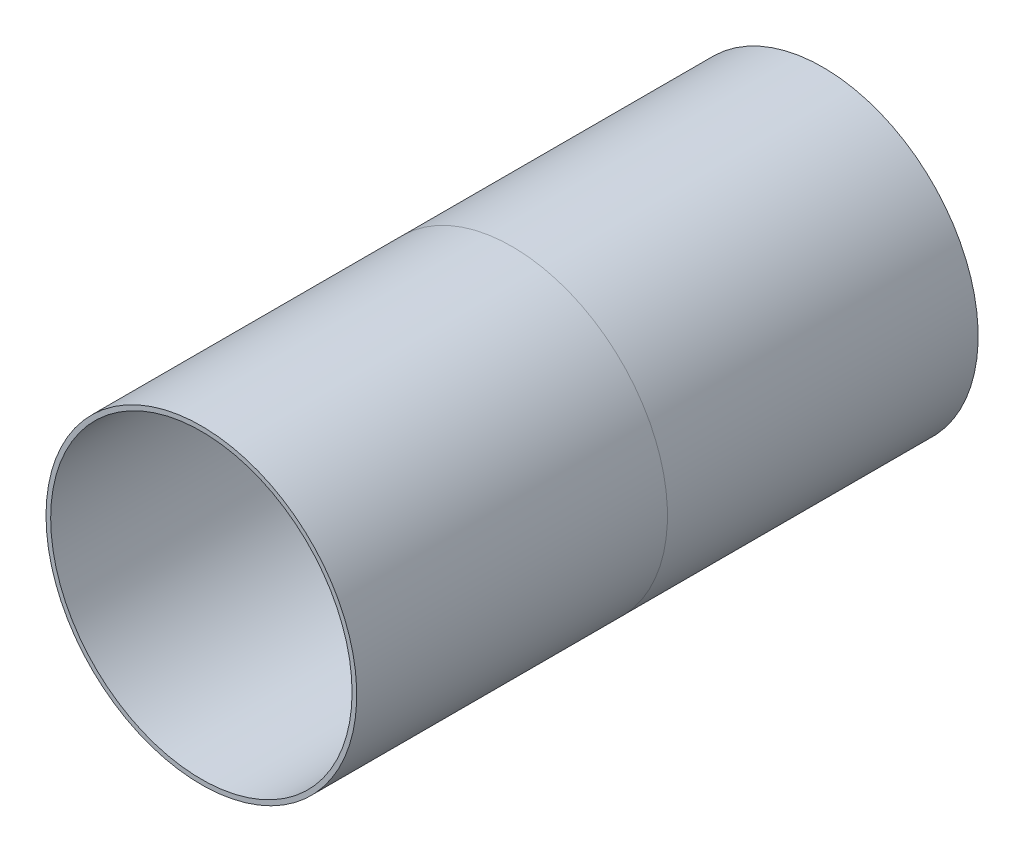
ISO-10303-21;
HEADER;
FILE_DESCRIPTION(('STEP AP214'),'2;1');
FILE_NAME('part.step','',(''),(''),'','','');
FILE_SCHEMA(('AUTOMOTIVE_DESIGN { 1 0 10303 214 1 1 1 1 }'));
ENDSEC;
DATA;
#1=APPLICATION_CONTEXT('core data for automotive mechanical design processes');
#2=APPLICATION_PROTOCOL_DEFINITION('international standard','automotive_design',2000,#1);
#3=PRODUCT_CONTEXT('',#1,'mechanical');
#4=PRODUCT('Part','Part','',(#3));
#5=PRODUCT_RELATED_PRODUCT_CATEGORY('part','',(#4));
#6=PRODUCT_DEFINITION_FORMATION('','',#4);
#7=PRODUCT_DEFINITION_CONTEXT('part definition',#1,'design');
#8=PRODUCT_DEFINITION('design','',#6,#7);
#9=PRODUCT_DEFINITION_SHAPE('','',#8);
#10=(LENGTH_UNIT() NAMED_UNIT(*) SI_UNIT(.MILLI.,.METRE.));
#11=(NAMED_UNIT(*) PLANE_ANGLE_UNIT() SI_UNIT($,.RADIAN.));
#12=(NAMED_UNIT(*) SI_UNIT($,.STERADIAN.) SOLID_ANGLE_UNIT());
#13=UNCERTAINTY_MEASURE_WITH_UNIT(LENGTH_MEASURE(1.E-05),#10,'distance_accuracy_value','');
#14=(GEOMETRIC_REPRESENTATION_CONTEXT(3) GLOBAL_UNCERTAINTY_ASSIGNED_CONTEXT((#13)) GLOBAL_UNIT_ASSIGNED_CONTEXT((#10,
#11,#12)) REPRESENTATION_CONTEXT('',''));
#15=CARTESIAN_POINT('',(0.,0.,0.));
#16=DIRECTION('',(0.,0.,1.));
#17=DIRECTION('',(1.,0.,0.));
#18=AXIS2_PLACEMENT_3D('',#15,#16,#17);
#19=CARTESIAN_POINT('',(0.,0.,0.));
#20=DIRECTION('',(0.,0.,1.));
#21=DIRECTION('',(1.,0.,0.));
#22=AXIS2_PLACEMENT_3D('',#19,#20,#21);
#23=PLANE('',#22);
#24=CARTESIAN_POINT('',(0.,0.,0.));
#25=DIRECTION('',(0.,0.,1.));
#26=DIRECTION('',(1.,0.,0.));
#27=AXIS2_PLACEMENT_3D('',#24,#25,#26);
#28=CIRCLE('',#27,76.1746);
#29=CARTESIAN_POINT('',(-76.1746,0.,0.));
#30=VERTEX_POINT('',#29);
#31=EDGE_CURVE('E45',#30,#30,#28,.T.);
#32=ORIENTED_EDGE('',*,*,#31,.F.);
#33=EDGE_LOOP('',(#32));
#34=FACE_BOUND('',#33,.T.);
#35=CARTESIAN_POINT('',(0.,0.,0.));
#36=DIRECTION('',(0.,0.,1.));
#37=DIRECTION('',(1.,0.,0.));
#38=AXIS2_PLACEMENT_3D('',#35,#36,#37);
#39=CIRCLE('',#38,73.914);
#40=CARTESIAN_POINT('',(-73.914,0.,0.));
#41=VERTEX_POINT('',#40);
#42=EDGE_CURVE('E52',#41,#41,#39,.T.);
#43=ORIENTED_EDGE('',*,*,#42,.T.);
#44=EDGE_LOOP('',(#43));
#45=FACE_BOUND('',#44,.T.);
#46=ADVANCED_FACE('F41',(#34,#45),#23,.F.);
#47=CARTESIAN_POINT('',(0.,0.,152.4));
#48=DIRECTION('',(0.,0.,-1.));
#49=DIRECTION('',(-1.,0.,0.));
#50=AXIS2_PLACEMENT_3D('',#47,#48,#49);
#51=CYLINDRICAL_SURFACE('',#50,76.1746);
#52=CARTESIAN_POINT('',(0.,0.,152.4));
#53=DIRECTION('',(0.,0.,1.));
#54=DIRECTION('',(1.,0.,0.));
#55=AXIS2_PLACEMENT_3D('',#52,#53,#54);
#56=CIRCLE('',#55,76.1746);
#57=CARTESIAN_POINT('',(-76.1746,0.,152.4));
#58=VERTEX_POINT('',#57);
#59=EDGE_CURVE('E10',#58,#58,#56,.T.);
#60=CARTESIAN_POINT('',(-76.1746,0.,152.4));
#61=CARTESIAN_POINT('',(-76.1746,0.,150.8125));
#62=CARTESIAN_POINT('',(-76.1746,0.,149.225));
#63=CARTESIAN_POINT('',(-76.1746,0.,146.05));
#64=CARTESIAN_POINT('',(-76.1746,0.,144.4625));
#65=CARTESIAN_POINT('',(-76.1746,0.,141.2875));
#66=CARTESIAN_POINT('',(-76.1746,0.,139.7));
#67=CARTESIAN_POINT('',(-76.1746,0.,136.525));
#68=CARTESIAN_POINT('',(-76.1746,0.,134.9375));
#69=CARTESIAN_POINT('',(-76.1746,0.,131.7625));
#70=CARTESIAN_POINT('',(-76.1746,0.,130.175));
#71=CARTESIAN_POINT('',(-76.1746,0.,127.));
#72=CARTESIAN_POINT('',(-76.1746,0.,125.4125));
#73=CARTESIAN_POINT('',(-76.1746,0.,122.2375));
#74=CARTESIAN_POINT('',(-76.1746,0.,120.65));
#75=CARTESIAN_POINT('',(-76.1746,0.,117.475));
#76=CARTESIAN_POINT('',(-76.1746,0.,115.8875));
#77=CARTESIAN_POINT('',(-76.1746,0.,112.7125));
#78=CARTESIAN_POINT('',(-76.1746,0.,111.125));
#79=CARTESIAN_POINT('',(-76.1746,0.,107.95));
#80=CARTESIAN_POINT('',(-76.1746,0.,106.3625));
#81=CARTESIAN_POINT('',(-76.1746,0.,103.1875));
#82=CARTESIAN_POINT('',(-76.1746,0.,101.6));
#83=CARTESIAN_POINT('',(-76.1746,0.,98.425));
#84=CARTESIAN_POINT('',(-76.1746,0.,96.8375));
#85=CARTESIAN_POINT('',(-76.1746,0.,93.6625));
#86=CARTESIAN_POINT('',(-76.1746,0.,92.075));
#87=CARTESIAN_POINT('',(-76.1746,0.,88.9));
#88=CARTESIAN_POINT('',(-76.1746,0.,87.3125));
#89=CARTESIAN_POINT('',(-76.1746,0.,84.1375));
#90=CARTESIAN_POINT('',(-76.1746,0.,82.55));
#91=CARTESIAN_POINT('',(-76.1746,0.,79.375));
#92=CARTESIAN_POINT('',(-76.1746,0.,77.7875));
#93=CARTESIAN_POINT('',(-76.1746,0.,74.6125));
#94=CARTESIAN_POINT('',(-76.1746,0.,73.025));
#95=CARTESIAN_POINT('',(-76.1746,0.,69.85));
#96=CARTESIAN_POINT('',(-76.1746,0.,68.2625));
#97=CARTESIAN_POINT('',(-76.1746,0.,65.0875));
#98=CARTESIAN_POINT('',(-76.1746,0.,63.5));
#99=CARTESIAN_POINT('',(-76.1746,0.,60.325));
#100=CARTESIAN_POINT('',(-76.1746,0.,58.7375));
#101=CARTESIAN_POINT('',(-76.1746,0.,55.5625));
#102=CARTESIAN_POINT('',(-76.1746,0.,53.975));
#103=CARTESIAN_POINT('',(-76.1746,0.,50.8));
#104=CARTESIAN_POINT('',(-76.1746,0.,49.2125));
#105=CARTESIAN_POINT('',(-76.1746,0.,46.0375));
#106=CARTESIAN_POINT('',(-76.1746,0.,44.45));
#107=CARTESIAN_POINT('',(-76.1746,0.,41.275));
#108=CARTESIAN_POINT('',(-76.1746,0.,39.6875));
#109=CARTESIAN_POINT('',(-76.1746,0.,36.5125));
#110=CARTESIAN_POINT('',(-76.1746,0.,34.925));
#111=CARTESIAN_POINT('',(-76.1746,0.,31.75));
#112=CARTESIAN_POINT('',(-76.1746,0.,30.1625));
#113=CARTESIAN_POINT('',(-76.1746,0.,26.9875));
#114=CARTESIAN_POINT('',(-76.1746,0.,25.4));
#115=CARTESIAN_POINT('',(-76.1746,0.,22.225));
#116=CARTESIAN_POINT('',(-76.1746,0.,20.6375));
#117=CARTESIAN_POINT('',(-76.1746,0.,17.4625));
#118=CARTESIAN_POINT('',(-76.1746,0.,15.875));
#119=CARTESIAN_POINT('',(-76.1746,0.,12.7));
#120=CARTESIAN_POINT('',(-76.1746,0.,11.1125));
#121=CARTESIAN_POINT('',(-76.1746,0.,7.93750000000001));
#122=CARTESIAN_POINT('',(-76.1746,0.,6.35));
#123=CARTESIAN_POINT('',(-76.1746,0.,3.175));
#124=CARTESIAN_POINT('',(-76.1746,0.,1.5875));
#125=CARTESIAN_POINT('',(-76.1746,0.,0.));
#126=B_SPLINE_CURVE_WITH_KNOTS('',3,(#60,#61,#62,#63,#64,#65,#66,#67,#68,#69,#70,#71,#72,#73,
#74,#75,#76,#77,#78,#79,#80,#81,#82,#83,#84,#85,#86,#87,#88,#89,#90,#91,#92,#93,#94,#95,#96,#97,
#98,#99,#100,#101,#102,#103,#104,#105,#106,#107,#108,#109,#110,#111,#112,#113,#114,#115,#116,
#117,#118,#119,#120,#121,#122,#123,#124,#125),.UNSPECIFIED.,.F.,.F.,(4,2,2,2,2,2,2,2,2,2,2,2,2,
2,2,2,2,2,2,2,2,2,2,2,2,2,2,2,2,2,2,2,4),(0.,4.76249999999998,9.52499999999998,14.2875,19.05,
23.8125,28.575,33.3375,38.1,42.8625,47.625,52.3875,57.15,61.9125,66.675,71.4375,76.2,80.9625,
85.725,90.4875,95.25,100.0125,104.775,109.5375,114.3,119.0625,123.825,128.5875,133.35,138.1125,
142.875,147.6375,152.4),.UNSPECIFIED.);
#127=EDGE_CURVE('BSEAM43',#58,#30,#126,.T.);
#128=ORIENTED_EDGE('',*,*,#59,.F.);
#129=ORIENTED_EDGE('',*,*,#31,.T.);
#130=ORIENTED_EDGE('',*,*,#127,.T.);
#131=ORIENTED_EDGE('',*,*,#127,.F.);
#132=EDGE_LOOP('',(#128,#130,#129,#131));
#133=FACE_BOUND('',#132,.T.);
#134=ADVANCED_FACE('F43',(#133),#51,.T.);
#135=CARTESIAN_POINT('',(0.,0.,152.4));
#136=DIRECTION('',(0.,0.,-1.));
#137=DIRECTION('',(-1.,0.,0.));
#138=AXIS2_PLACEMENT_3D('',#135,#136,#137);
#139=CYLINDRICAL_SURFACE('',#138,73.914);
#140=CARTESIAN_POINT('',(0.,0.,304.8));
#141=DIRECTION('',(0.,0.,1.));
#142=DIRECTION('',(1.,0.,0.));
#143=AXIS2_PLACEMENT_3D('',#140,#141,#142);
#144=CIRCLE('',#143,73.914);
#145=CARTESIAN_POINT('',(-73.914,0.,304.8));
#146=VERTEX_POINT('',#145);
#147=EDGE_CURVE('E60',#146,#146,#144,.T.);
#148=CARTESIAN_POINT('',(-73.914,0.,0.));
#149=CARTESIAN_POINT('',(-73.914,0.,3.175));
#150=CARTESIAN_POINT('',(-73.914,0.,6.35));
#151=CARTESIAN_POINT('',(-73.914,0.,12.7));
#152=CARTESIAN_POINT('',(-73.914,0.,15.875));
#153=CARTESIAN_POINT('',(-73.914,0.,22.225));
#154=CARTESIAN_POINT('',(-73.914,0.,25.4));
#155=CARTESIAN_POINT('',(-73.914,0.,31.75));
#156=CARTESIAN_POINT('',(-73.914,0.,34.925));
#157=CARTESIAN_POINT('',(-73.914,0.,41.275));
#158=CARTESIAN_POINT('',(-73.914,0.,44.45));
#159=CARTESIAN_POINT('',(-73.914,0.,50.8));
#160=CARTESIAN_POINT('',(-73.914,0.,53.975));
#161=CARTESIAN_POINT('',(-73.914,0.,60.325));
#162=CARTESIAN_POINT('',(-73.914,0.,63.5));
#163=CARTESIAN_POINT('',(-73.914,0.,69.85));
#164=CARTESIAN_POINT('',(-73.914,0.,73.025));
#165=CARTESIAN_POINT('',(-73.914,0.,79.375));
#166=CARTESIAN_POINT('',(-73.914,0.,82.55));
#167=CARTESIAN_POINT('',(-73.914,0.,88.9));
#168=CARTESIAN_POINT('',(-73.914,0.,92.075));
#169=CARTESIAN_POINT('',(-73.914,0.,98.425));
#170=CARTESIAN_POINT('',(-73.914,0.,101.6));
#171=CARTESIAN_POINT('',(-73.914,0.,107.95));
#172=CARTESIAN_POINT('',(-73.914,0.,111.125));
#173=CARTESIAN_POINT('',(-73.914,0.,117.475));
#174=CARTESIAN_POINT('',(-73.914,0.,120.65));
#175=CARTESIAN_POINT('',(-73.914,0.,127.));
#176=CARTESIAN_POINT('',(-73.914,0.,130.175));
#177=CARTESIAN_POINT('',(-73.914,0.,136.525));
#178=CARTESIAN_POINT('',(-73.914,0.,139.7));
#179=CARTESIAN_POINT('',(-73.914,0.,146.05));
#180=CARTESIAN_POINT('',(-73.914,0.,149.225));
#181=CARTESIAN_POINT('',(-73.914,0.,155.575));
#182=CARTESIAN_POINT('',(-73.914,0.,158.75));
#183=CARTESIAN_POINT('',(-73.914,0.,165.1));
#184=CARTESIAN_POINT('',(-73.914,0.,168.275));
#185=CARTESIAN_POINT('',(-73.914,0.,174.625));
#186=CARTESIAN_POINT('',(-73.914,0.,177.8));
#187=CARTESIAN_POINT('',(-73.914,0.,184.15));
#188=CARTESIAN_POINT('',(-73.914,0.,187.325));
#189=CARTESIAN_POINT('',(-73.914,0.,193.675));
#190=CARTESIAN_POINT('',(-73.914,0.,196.85));
#191=CARTESIAN_POINT('',(-73.914,0.,203.2));
#192=CARTESIAN_POINT('',(-73.914,0.,206.375));
#193=CARTESIAN_POINT('',(-73.914,0.,212.725));
#194=CARTESIAN_POINT('',(-73.914,0.,215.9));
#195=CARTESIAN_POINT('',(-73.914,0.,222.25));
#196=CARTESIAN_POINT('',(-73.914,0.,225.425));
#197=CARTESIAN_POINT('',(-73.914,0.,231.775));
#198=CARTESIAN_POINT('',(-73.914,0.,234.95));
#199=CARTESIAN_POINT('',(-73.914,0.,241.3));
#200=CARTESIAN_POINT('',(-73.914,0.,244.475));
#201=CARTESIAN_POINT('',(-73.914,0.,250.825));
#202=CARTESIAN_POINT('',(-73.914,0.,254.));
#203=CARTESIAN_POINT('',(-73.914,0.,260.35));
#204=CARTESIAN_POINT('',(-73.914,0.,263.525));
#205=CARTESIAN_POINT('',(-73.914,0.,269.875));
#206=CARTESIAN_POINT('',(-73.914,0.,273.05));
#207=CARTESIAN_POINT('',(-73.914,0.,279.4));
#208=CARTESIAN_POINT('',(-73.914,0.,282.575));
#209=CARTESIAN_POINT('',(-73.914,0.,288.925));
#210=CARTESIAN_POINT('',(-73.914,0.,292.1));
#211=CARTESIAN_POINT('',(-73.914,0.,298.45));
#212=CARTESIAN_POINT('',(-73.914,0.,301.625));
#213=CARTESIAN_POINT('',(-73.914,0.,304.8));
#214=B_SPLINE_CURVE_WITH_KNOTS('',3,(#148,#149,#150,#151,#152,#153,#154,#155,#156,#157,#158,
#159,#160,#161,#162,#163,#164,#165,#166,#167,#168,#169,#170,#171,#172,#173,#174,#175,#176,#177,
#178,#179,#180,#181,#182,#183,#184,#185,#186,#187,#188,#189,#190,#191,#192,#193,#194,#195,#196,
#197,#198,#199,#200,#201,#202,#203,#204,#205,#206,#207,#208,#209,#210,#211,#212,#213),
.UNSPECIFIED.,.F.,.F.,(4,2,2,2,2,2,2,2,2,2,2,2,2,2,2,2,2,2,2,2,2,2,2,2,2,2,2,2,2,2,2,2,4),(0.,
9.52500000000001,19.05,28.575,38.1,47.625,57.15,66.675,76.2,85.725,95.25,104.775,114.3,123.825,
133.35,142.875,152.4,161.925,171.45,180.975,190.5,200.025,209.55,219.075,228.6,238.125,247.65,
257.175,266.7,276.225,285.75,295.275,304.8),.UNSPECIFIED.);
#215=EDGE_CURVE('BSEAM66',#41,#146,#214,.T.);
#216=ORIENTED_EDGE('',*,*,#42,.F.);
#217=ORIENTED_EDGE('',*,*,#147,.T.);
#218=ORIENTED_EDGE('',*,*,#215,.T.);
#219=ORIENTED_EDGE('',*,*,#215,.F.);
#220=EDGE_LOOP('',(#216,#218,#217,#219));
#221=FACE_BOUND('',#220,.T.);
#222=ADVANCED_FACE('F66',(#221),#139,.F.);
#223=CARTESIAN_POINT('',(0.,0.,304.8));
#224=DIRECTION('',(0.,0.,1.));
#225=DIRECTION('',(1.,0.,0.));
#226=AXIS2_PLACEMENT_3D('',#223,#224,#225);
#227=PLANE('',#226);
#228=CARTESIAN_POINT('',(0.,0.,304.8));
#229=DIRECTION('',(0.,0.,1.));
#230=DIRECTION('',(1.,0.,0.));
#231=AXIS2_PLACEMENT_3D('',#228,#229,#230);
#232=CIRCLE('',#231,76.2);
#233=CARTESIAN_POINT('',(-76.2,0.,304.8));
#234=VERTEX_POINT('',#233);
#235=EDGE_CURVE('E56',#234,#234,#232,.T.);
#236=ORIENTED_EDGE('',*,*,#235,.T.);
#237=EDGE_LOOP('',(#236));
#238=FACE_BOUND('',#237,.T.);
#239=ORIENTED_EDGE('',*,*,#147,.F.);
#240=EDGE_LOOP('',(#239));
#241=FACE_BOUND('',#240,.T.);
#242=ADVANCED_FACE('F68',(#238,#241),#227,.T.);
#243=CARTESIAN_POINT('',(0.,0.,152.4));
#244=DIRECTION('',(0.,0.,1.));
#245=DIRECTION('',(1.,0.,0.));
#246=AXIS2_PLACEMENT_3D('',#243,#244,#245);
#247=PLANE('',#246);
#248=ORIENTED_EDGE('',*,*,#59,.T.);
#249=EDGE_LOOP('',(#248));
#250=FACE_BOUND('',#249,.T.);
#251=CARTESIAN_POINT('',(0.,0.,152.4));
#252=DIRECTION('',(0.,0.,1.));
#253=DIRECTION('',(1.,0.,0.));
#254=AXIS2_PLACEMENT_3D('',#251,#252,#253);
#255=CIRCLE('',#254,76.2);
#256=CARTESIAN_POINT('',(-76.2,0.,152.4));
#257=VERTEX_POINT('',#256);
#258=EDGE_CURVE('E57',#257,#257,#255,.T.);
#259=ORIENTED_EDGE('',*,*,#258,.F.);
#260=EDGE_LOOP('',(#259));
#261=FACE_BOUND('',#260,.T.);
#262=ADVANCED_FACE('F70',(#250,#261),#247,.F.);
#263=CARTESIAN_POINT('',(0.,0.,304.8));
#264=DIRECTION('',(0.,0.,-1.));
#265=DIRECTION('',(-1.,0.,0.));
#266=AXIS2_PLACEMENT_3D('',#263,#264,#265);
#267=CYLINDRICAL_SURFACE('',#266,76.2);
#268=CARTESIAN_POINT('',(-76.2,0.,304.8));
#269=CARTESIAN_POINT('',(-76.2,0.,303.2125));
#270=CARTESIAN_POINT('',(-76.2,0.,301.625));
#271=CARTESIAN_POINT('',(-76.2,0.,298.45));
#272=CARTESIAN_POINT('',(-76.2,0.,296.8625));
#273=CARTESIAN_POINT('',(-76.2,0.,293.6875));
#274=CARTESIAN_POINT('',(-76.2,0.,292.1));
#275=CARTESIAN_POINT('',(-76.2,0.,288.925));
#276=CARTESIAN_POINT('',(-76.2,0.,287.3375));
#277=CARTESIAN_POINT('',(-76.2,0.,284.1625));
#278=CARTESIAN_POINT('',(-76.2,0.,282.575));
#279=CARTESIAN_POINT('',(-76.2,0.,279.4));
#280=CARTESIAN_POINT('',(-76.2,0.,277.8125));
#281=CARTESIAN_POINT('',(-76.2,0.,274.6375));
#282=CARTESIAN_POINT('',(-76.2,0.,273.05));
#283=CARTESIAN_POINT('',(-76.2,0.,269.875));
#284=CARTESIAN_POINT('',(-76.2,0.,268.2875));
#285=CARTESIAN_POINT('',(-76.2,0.,265.1125));
#286=CARTESIAN_POINT('',(-76.2,0.,263.525));
#287=CARTESIAN_POINT('',(-76.2,0.,260.35));
#288=CARTESIAN_POINT('',(-76.2,0.,258.7625));
#289=CARTESIAN_POINT('',(-76.2,0.,255.5875));
#290=CARTESIAN_POINT('',(-76.2,0.,254.));
#291=CARTESIAN_POINT('',(-76.2,0.,250.825));
#292=CARTESIAN_POINT('',(-76.2,0.,249.2375));
#293=CARTESIAN_POINT('',(-76.2,0.,246.0625));
#294=CARTESIAN_POINT('',(-76.2,0.,244.475));
#295=CARTESIAN_POINT('',(-76.2,0.,241.3));
#296=CARTESIAN_POINT('',(-76.2,0.,239.7125));
#297=CARTESIAN_POINT('',(-76.2,0.,236.5375));
#298=CARTESIAN_POINT('',(-76.2,0.,234.95));
#299=CARTESIAN_POINT('',(-76.2,0.,231.775));
#300=CARTESIAN_POINT('',(-76.2,0.,230.1875));
#301=CARTESIAN_POINT('',(-76.2,0.,227.0125));
#302=CARTESIAN_POINT('',(-76.2,0.,225.425));
#303=CARTESIAN_POINT('',(-76.2,0.,222.25));
#304=CARTESIAN_POINT('',(-76.2,0.,220.6625));
#305=CARTESIAN_POINT('',(-76.2,0.,217.4875));
#306=CARTESIAN_POINT('',(-76.2,0.,215.9));
#307=CARTESIAN_POINT('',(-76.2,0.,212.725));
#308=CARTESIAN_POINT('',(-76.2,0.,211.1375));
#309=CARTESIAN_POINT('',(-76.2,0.,207.9625));
#310=CARTESIAN_POINT('',(-76.2,0.,206.375));
#311=CARTESIAN_POINT('',(-76.2,0.,203.2));
#312=CARTESIAN_POINT('',(-76.2,0.,201.6125));
#313=CARTESIAN_POINT('',(-76.2,0.,198.4375));
#314=CARTESIAN_POINT('',(-76.2,0.,196.85));
#315=CARTESIAN_POINT('',(-76.2,0.,193.675));
#316=CARTESIAN_POINT('',(-76.2,0.,192.0875));
#317=CARTESIAN_POINT('',(-76.2,0.,188.9125));
#318=CARTESIAN_POINT('',(-76.2,0.,187.325));
#319=CARTESIAN_POINT('',(-76.2,0.,184.15));
#320=CARTESIAN_POINT('',(-76.2,0.,182.5625));
#321=CARTESIAN_POINT('',(-76.2,0.,179.3875));
#322=CARTESIAN_POINT('',(-76.2,0.,177.8));
#323=CARTESIAN_POINT('',(-76.2,0.,174.625));
#324=CARTESIAN_POINT('',(-76.2,0.,173.0375));
#325=CARTESIAN_POINT('',(-76.2,0.,169.8625));
#326=CARTESIAN_POINT('',(-76.2,0.,168.275));
#327=CARTESIAN_POINT('',(-76.2,0.,165.1));
#328=CARTESIAN_POINT('',(-76.2,0.,163.5125));
#329=CARTESIAN_POINT('',(-76.2,0.,160.3375));
#330=CARTESIAN_POINT('',(-76.2,0.,158.75));
#331=CARTESIAN_POINT('',(-76.2,0.,155.575));
#332=CARTESIAN_POINT('',(-76.2,0.,153.9875));
#333=CARTESIAN_POINT('',(-76.2,0.,152.4));
#334=B_SPLINE_CURVE_WITH_KNOTS('',3,(#268,#269,#270,#271,#272,#273,#274,#275,#276,#277,#278,
#279,#280,#281,#282,#283,#284,#285,#286,#287,#288,#289,#290,#291,#292,#293,#294,#295,#296,#297,
#298,#299,#300,#301,#302,#303,#304,#305,#306,#307,#308,#309,#310,#311,#312,#313,#314,#315,#316,
#317,#318,#319,#320,#321,#322,#323,#324,#325,#326,#327,#328,#329,#330,#331,#332,#333),
.UNSPECIFIED.,.F.,.F.,(4,2,2,2,2,2,2,2,2,2,2,2,2,2,2,2,2,2,2,2,2,2,2,2,2,2,2,2,2,2,2,2,4),(0.,
4.7625,9.52500000000001,14.2875,19.05,23.8125,28.575,33.3375,38.1,42.8625,47.625,52.3875,57.15,
61.9125,66.675,71.4375,76.2,80.9625,85.725,90.4875,95.25,100.0125,104.775,109.5375,114.3,
119.0625,123.825,128.5875,133.35,138.1125,142.875,147.6375,152.4),.UNSPECIFIED.);
#335=EDGE_CURVE('BSEAM77',#234,#257,#334,.T.);
#336=ORIENTED_EDGE('',*,*,#235,.F.);
#337=ORIENTED_EDGE('',*,*,#258,.T.);
#338=ORIENTED_EDGE('',*,*,#335,.T.);
#339=ORIENTED_EDGE('',*,*,#335,.F.);
#340=EDGE_LOOP('',(#336,#338,#337,#339));
#341=FACE_BOUND('',#340,.T.);
#342=ADVANCED_FACE('F77',(#341),#267,.T.);
#343=CLOSED_SHELL('',(#46,#134,#222,#242,#262,#342));
#344=MANIFOLD_SOLID_BREP('B2',#343);
#345=ADVANCED_BREP_SHAPE_REPRESENTATION('',(#18,#344),#14);
#346=SHAPE_DEFINITION_REPRESENTATION(#9,#345);
ENDSEC;
END-ISO-10303-21;
